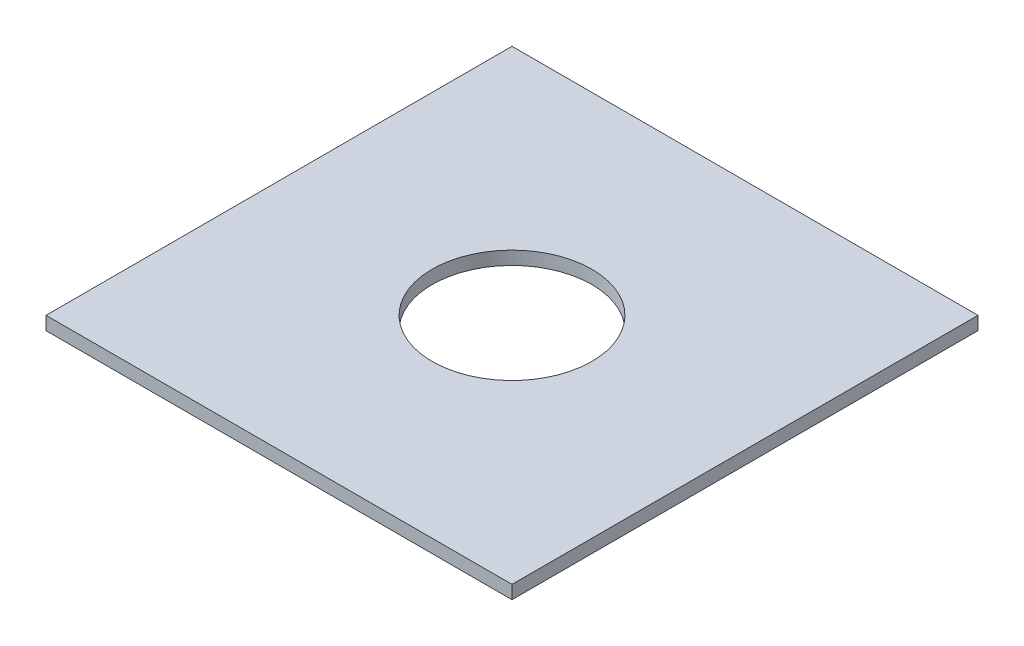
ISO-10303-21;
HEADER;
FILE_DESCRIPTION(('STEP AP214'),'2;1');
FILE_NAME('part.step','',(''),(''),'','','');
FILE_SCHEMA(('AUTOMOTIVE_DESIGN { 1 0 10303 214 1 1 1 1 }'));
ENDSEC;
DATA;
#1=APPLICATION_CONTEXT('core data for automotive mechanical design processes');
#2=APPLICATION_PROTOCOL_DEFINITION('international standard','automotive_design',2000,#1);
#3=PRODUCT_CONTEXT('',#1,'mechanical');
#4=PRODUCT('Part','Part','',(#3));
#5=PRODUCT_RELATED_PRODUCT_CATEGORY('part','',(#4));
#6=PRODUCT_DEFINITION_FORMATION('','',#4);
#7=PRODUCT_DEFINITION_CONTEXT('part definition',#1,'design');
#8=PRODUCT_DEFINITION('design','',#6,#7);
#9=PRODUCT_DEFINITION_SHAPE('','',#8);
#10=(LENGTH_UNIT() NAMED_UNIT(*) SI_UNIT(.MILLI.,.METRE.));
#11=(NAMED_UNIT(*) PLANE_ANGLE_UNIT() SI_UNIT($,.RADIAN.));
#12=(NAMED_UNIT(*) SI_UNIT($,.STERADIAN.) SOLID_ANGLE_UNIT());
#13=UNCERTAINTY_MEASURE_WITH_UNIT(LENGTH_MEASURE(1.E-05),#10,'distance_accuracy_value','');
#14=(GEOMETRIC_REPRESENTATION_CONTEXT(3) GLOBAL_UNCERTAINTY_ASSIGNED_CONTEXT((#13)) GLOBAL_UNIT_ASSIGNED_CONTEXT((#10,
#11,#12)) REPRESENTATION_CONTEXT('',''));
#15=CARTESIAN_POINT('',(0.,0.,0.));
#16=DIRECTION('',(0.,0.,1.));
#17=DIRECTION('',(1.,0.,0.));
#18=AXIS2_PLACEMENT_3D('',#15,#16,#17);
#19=CARTESIAN_POINT('',(0.,0.,0.));
#20=DIRECTION('',(0.,1.,0.));
#21=DIRECTION('',(0.,0.,1.));
#22=AXIS2_PLACEMENT_3D('',#19,#20,#21);
#23=PLANE('',#22);
#24=CARTESIAN_POINT('',(0.,0.,0.));
#25=DIRECTION('',(0.,-1.,0.));
#26=DIRECTION('',(0.,0.,-1.));
#27=AXIS2_PLACEMENT_3D('',#24,#25,#26);
#28=CIRCLE('',#27,0.6);
#29=CARTESIAN_POINT('',(0.,0.,-0.6));
#30=VERTEX_POINT('',#29);
#31=EDGE_CURVE('E19',#30,#30,#28,.F.);
#32=ORIENTED_EDGE('',*,*,#31,.T.);
#33=EDGE_LOOP('',(#32));
#34=FACE_BOUND('',#33,.T.);
#35=DIRECTION('',(1.,0.,0.));
#36=VECTOR('',#35,1.);
#37=CARTESIAN_POINT('',(1.74999999999989,0.,-1.75));
#38=LINE('',#37,#36);
#39=CARTESIAN_POINT('',(-1.7500000000001,0.,-1.75000000000007));
#40=VERTEX_POINT('',#39);
#41=CARTESIAN_POINT('',(1.74999999999989,0.,-1.75));
#42=VERTEX_POINT('',#41);
#43=EDGE_CURVE('E82',#40,#42,#38,.T.);
#44=ORIENTED_EDGE('',*,*,#43,.T.);
#45=DIRECTION('',(0.,0.,1.));
#46=VECTOR('',#45,1.);
#47=CARTESIAN_POINT('',(1.74999999999999,0.,1.75));
#48=LINE('',#47,#46);
#49=CARTESIAN_POINT('',(1.74999999999999,0.,1.75));
#50=VERTEX_POINT('',#49);
#51=EDGE_CURVE('E68',#42,#50,#48,.T.);
#52=ORIENTED_EDGE('',*,*,#51,.T.);
#53=DIRECTION('',(-1.,0.,0.));
#54=VECTOR('',#53,1.);
#55=CARTESIAN_POINT('',(1.74999999999999,0.,1.75));
#56=LINE('',#55,#54);
#57=CARTESIAN_POINT('',(-1.75,0.,1.74999999999993));
#58=VERTEX_POINT('',#57);
#59=EDGE_CURVE('E53',#50,#58,#56,.T.);
#60=ORIENTED_EDGE('',*,*,#59,.T.);
#61=DIRECTION('',(0.,0.,-1.));
#62=VECTOR('',#61,1.);
#63=CARTESIAN_POINT('',(-1.75,0.,1.74999999999993));
#64=LINE('',#63,#62);
#65=EDGE_CURVE('E58',#58,#40,#64,.T.);
#66=ORIENTED_EDGE('',*,*,#65,.T.);
#67=EDGE_LOOP('',(#44,#52,#60,#66));
#68=FACE_BOUND('',#67,.T.);
#69=ADVANCED_FACE('F16',(#34,#68),#23,.F.);
#70=CARTESIAN_POINT('',(-1.75,0.100000000000003,1.74999999999993));
#71=DIRECTION('',(1.,0.,0.));
#72=DIRECTION('',(0.,0.,-1.));
#73=AXIS2_PLACEMENT_3D('',#70,#71,#72);
#74=PLANE('',#73);
#75=DIRECTION('',(0.,1.,0.));
#76=VECTOR('',#75,1.);
#77=CARTESIAN_POINT('',(-1.75,0.100000000000003,1.74999999999993));
#78=LINE('',#77,#76);
#79=CARTESIAN_POINT('',(-1.75,0.100000000000003,1.74999999999993));
#80=VERTEX_POINT('',#79);
#81=EDGE_CURVE('E60',#58,#80,#78,.T.);
#82=ORIENTED_EDGE('',*,*,#81,.T.);
#83=DIRECTION('',(0.,0.,1.));
#84=VECTOR('',#83,1.);
#85=CARTESIAN_POINT('',(-1.75,0.100000000000003,0.));
#86=LINE('',#85,#84);
#87=CARTESIAN_POINT('',(-1.7500000000001,0.100000000000003,-1.75000000000007));
#88=VERTEX_POINT('',#87);
#89=EDGE_CURVE('E84',#88,#80,#86,.T.);
#90=ORIENTED_EDGE('',*,*,#89,.F.);
#91=DIRECTION('',(0.,1.,0.));
#92=VECTOR('',#91,1.);
#93=CARTESIAN_POINT('',(-1.7500000000001,0.100000000000003,-1.75000000000007));
#94=LINE('',#93,#92);
#95=EDGE_CURVE('E63',#88,#40,#94,.F.);
#96=ORIENTED_EDGE('',*,*,#95,.T.);
#97=ORIENTED_EDGE('',*,*,#65,.F.);
#98=EDGE_LOOP('',(#82,#90,#96,#97));
#99=FACE_BOUND('',#98,.T.);
#100=ADVANCED_FACE('F59',(#99),#74,.F.);
#101=CARTESIAN_POINT('',(1.74999999999999,0.100000000000003,1.75));
#102=DIRECTION('',(0.,0.,-1.));
#103=DIRECTION('',(-1.,0.,0.));
#104=AXIS2_PLACEMENT_3D('',#101,#102,#103);
#105=PLANE('',#104);
#106=DIRECTION('',(0.,1.,0.));
#107=VECTOR('',#106,1.);
#108=CARTESIAN_POINT('',(1.74999999999999,0.100000000000003,1.75));
#109=LINE('',#108,#107);
#110=CARTESIAN_POINT('',(1.74999999999999,0.100000000000003,1.75));
#111=VERTEX_POINT('',#110);
#112=EDGE_CURVE('E70',#50,#111,#109,.T.);
#113=ORIENTED_EDGE('',*,*,#112,.T.);
#114=DIRECTION('',(1.,0.,0.));
#115=VECTOR('',#114,1.);
#116=CARTESIAN_POINT('',(0.,0.100000000000003,1.75));
#117=LINE('',#116,#115);
#118=EDGE_CURVE('E74',#80,#111,#117,.T.);
#119=ORIENTED_EDGE('',*,*,#118,.F.);
#120=ORIENTED_EDGE('',*,*,#81,.F.);
#121=ORIENTED_EDGE('',*,*,#59,.F.);
#122=EDGE_LOOP('',(#113,#119,#120,#121));
#123=FACE_BOUND('',#122,.T.);
#124=ADVANCED_FACE('F72',(#123),#105,.F.);
#125=CARTESIAN_POINT('',(1.74999999999999,0.100000000000003,1.75));
#126=DIRECTION('',(-1.,0.,0.));
#127=DIRECTION('',(0.,0.,1.));
#128=AXIS2_PLACEMENT_3D('',#125,#126,#127);
#129=PLANE('',#128);
#130=DIRECTION('',(0.,1.,0.));
#131=VECTOR('',#130,1.);
#132=CARTESIAN_POINT('',(1.74999999999989,0.100000000000003,-1.75));
#133=LINE('',#132,#131);
#134=CARTESIAN_POINT('',(1.74999999999989,0.100000000000003,-1.75));
#135=VERTEX_POINT('',#134);
#136=EDGE_CURVE('E33',#42,#135,#133,.T.);
#137=ORIENTED_EDGE('',*,*,#136,.T.);
#138=DIRECTION('',(0.,0.,1.));
#139=VECTOR('',#138,1.);
#140=CARTESIAN_POINT('',(1.75,0.100000000000003,0.));
#141=LINE('',#140,#139);
#142=EDGE_CURVE('E87',#111,#135,#141,.F.);
#143=ORIENTED_EDGE('',*,*,#142,.F.);
#144=ORIENTED_EDGE('',*,*,#112,.F.);
#145=ORIENTED_EDGE('',*,*,#51,.F.);
#146=EDGE_LOOP('',(#137,#143,#144,#145));
#147=FACE_BOUND('',#146,.T.);
#148=ADVANCED_FACE('F97',(#147),#129,.F.);
#149=CARTESIAN_POINT('',(1.74999999999989,0.100000000000003,-1.75));
#150=DIRECTION('',(0.,0.,1.));
#151=DIRECTION('',(1.,0.,0.));
#152=AXIS2_PLACEMENT_3D('',#149,#150,#151);
#153=PLANE('',#152);
#154=ORIENTED_EDGE('',*,*,#95,.F.);
#155=DIRECTION('',(1.,0.,0.));
#156=VECTOR('',#155,1.);
#157=CARTESIAN_POINT('',(-1.11022302462516E-13,0.100000000000003,-1.75));
#158=LINE('',#157,#156);
#159=EDGE_CURVE('E25',#135,#88,#158,.F.);
#160=ORIENTED_EDGE('',*,*,#159,.F.);
#161=ORIENTED_EDGE('',*,*,#136,.F.);
#162=ORIENTED_EDGE('',*,*,#43,.F.);
#163=EDGE_LOOP('',(#154,#160,#161,#162));
#164=FACE_BOUND('',#163,.T.);
#165=ADVANCED_FACE('F94',(#164),#153,.F.);
#166=CARTESIAN_POINT('',(0.,0.100000000000003,0.));
#167=DIRECTION('',(0.,-1.,0.));
#168=DIRECTION('',(0.,0.,-1.));
#169=AXIS2_PLACEMENT_3D('',#166,#167,#168);
#170=CYLINDRICAL_SURFACE('',#169,0.6);
#171=CARTESIAN_POINT('',(0.,0.100000000000003,0.));
#172=DIRECTION('',(0.,-1.,0.));
#173=DIRECTION('',(0.,0.,-1.));
#174=AXIS2_PLACEMENT_3D('',#171,#172,#173);
#175=CIRCLE('',#174,0.6);
#176=CARTESIAN_POINT('',(0.,0.100000000000003,-0.6));
#177=VERTEX_POINT('',#176);
#178=EDGE_CURVE('E11',#177,#177,#175,.T.);
#179=ORIENTED_EDGE('',*,*,#178,.F.);
#180=EDGE_LOOP('',(#179));
#181=FACE_BOUND('',#180,.T.);
#182=ORIENTED_EDGE('',*,*,#31,.F.);
#183=EDGE_LOOP('',(#182));
#184=FACE_BOUND('',#183,.T.);
#185=ADVANCED_FACE('F96',(#181,#184),#170,.F.);
#186=CARTESIAN_POINT('',(0.,0.100000000000003,0.));
#187=DIRECTION('',(0.,1.,0.));
#188=DIRECTION('',(0.,0.,1.));
#189=AXIS2_PLACEMENT_3D('',#186,#187,#188);
#190=PLANE('',#189);
#191=ORIENTED_EDGE('',*,*,#178,.T.);
#192=EDGE_LOOP('',(#191));
#193=FACE_BOUND('',#192,.T.);
#194=ORIENTED_EDGE('',*,*,#142,.T.);
#195=ORIENTED_EDGE('',*,*,#159,.T.);
#196=ORIENTED_EDGE('',*,*,#89,.T.);
#197=ORIENTED_EDGE('',*,*,#118,.T.);
#198=EDGE_LOOP('',(#194,#195,#196,#197));
#199=FACE_BOUND('',#198,.T.);
#200=ADVANCED_FACE('F92',(#193,#199),#190,.T.);
#201=CLOSED_SHELL('',(#69,#100,#124,#148,#165,#185,#200));
#202=MANIFOLD_SOLID_BREP('B1',#201);
#203=ADVANCED_BREP_SHAPE_REPRESENTATION('',(#18,#202),#14);
#204=SHAPE_DEFINITION_REPRESENTATION(#9,#203);
ENDSEC;
END-ISO-10303-21;
